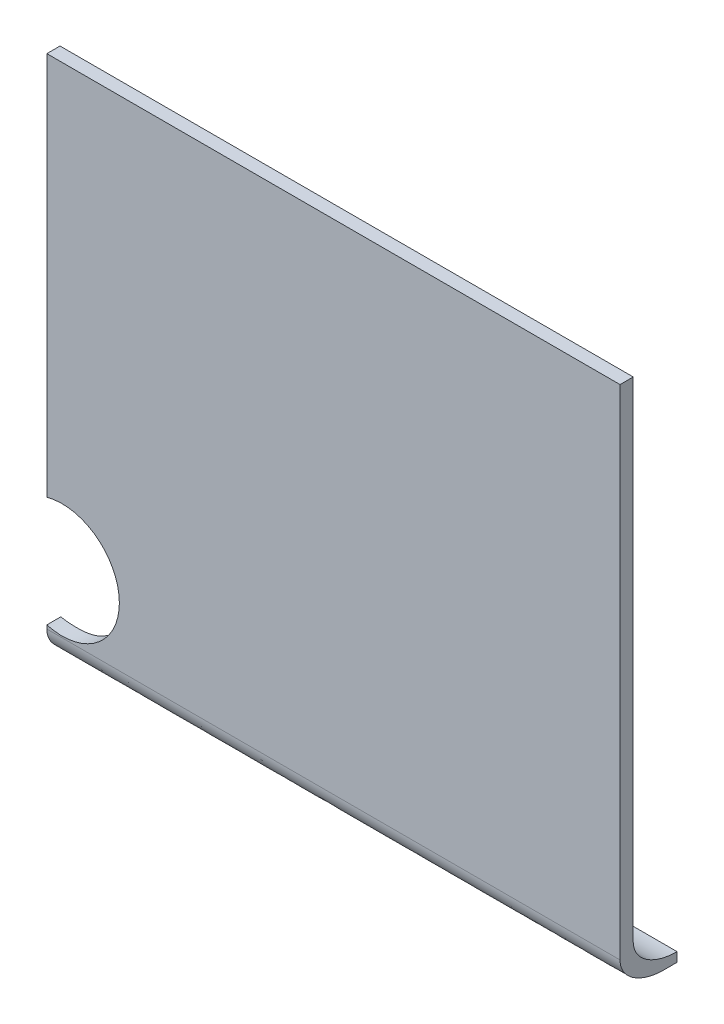
ISO-10303-21;
HEADER;
FILE_DESCRIPTION(('STEP AP214'),'2;1');
FILE_NAME('part.step','',(''),(''),'','','');
FILE_SCHEMA(('AUTOMOTIVE_DESIGN { 1 0 10303 214 1 1 1 1 }'));
ENDSEC;
DATA;
#1=APPLICATION_CONTEXT('core data for automotive mechanical design processes');
#2=APPLICATION_PROTOCOL_DEFINITION('international standard','automotive_design',2000,#1);
#3=PRODUCT_CONTEXT('',#1,'mechanical');
#4=PRODUCT('Part','Part','',(#3));
#5=PRODUCT_RELATED_PRODUCT_CATEGORY('part','',(#4));
#6=PRODUCT_DEFINITION_FORMATION('','',#4);
#7=PRODUCT_DEFINITION_CONTEXT('part definition',#1,'design');
#8=PRODUCT_DEFINITION('design','',#6,#7);
#9=PRODUCT_DEFINITION_SHAPE('','',#8);
#10=(LENGTH_UNIT() NAMED_UNIT(*) SI_UNIT(.MILLI.,.METRE.));
#11=(NAMED_UNIT(*) PLANE_ANGLE_UNIT() SI_UNIT($,.RADIAN.));
#12=(NAMED_UNIT(*) SI_UNIT($,.STERADIAN.) SOLID_ANGLE_UNIT());
#13=UNCERTAINTY_MEASURE_WITH_UNIT(LENGTH_MEASURE(1.E-05),#10,'distance_accuracy_value','');
#14=(GEOMETRIC_REPRESENTATION_CONTEXT(3) GLOBAL_UNCERTAINTY_ASSIGNED_CONTEXT((#13)) GLOBAL_UNIT_ASSIGNED_CONTEXT((#10,
#11,#12)) REPRESENTATION_CONTEXT('',''));
#15=CARTESIAN_POINT('',(0.,0.,0.));
#16=DIRECTION('',(0.,0.,1.));
#17=DIRECTION('',(1.,0.,0.));
#18=AXIS2_PLACEMENT_3D('',#15,#16,#17);
#19=CARTESIAN_POINT('',(-150.,0.,0.));
#20=DIRECTION('',(1.,0.,0.));
#21=DIRECTION('',(0.,0.,-1.));
#22=AXIS2_PLACEMENT_3D('',#19,#20,#21);
#23=PLANE('',#22);
#24=DIRECTION('',(0.,1.,0.));
#25=VECTOR('',#24,1.);
#26=CARTESIAN_POINT('',(-150.,25.118910613293,233.450026632189));
#27=LINE('',#26,#25);
#28=CARTESIAN_POINT('',(-150.,44.5820382074878,233.450026632189));
#29=VERTEX_POINT('',#28);
#30=CARTESIAN_POINT('',(-150.,145.118910613293,233.450026632189));
#31=VERTEX_POINT('',#30);
#32=EDGE_CURVE('E273',#29,#31,#27,.T.);
#33=ORIENTED_EDGE('',*,*,#32,.T.);
#34=DIRECTION('',(0.,0.,1.));
#35=VECTOR('',#34,1.);
#36=CARTESIAN_POINT('',(-150.,145.118910613293,230.000026632189));
#37=LINE('',#36,#35);
#38=CARTESIAN_POINT('',(-150.,145.118910613293,230.000026632189));
#39=VERTEX_POINT('',#38);
#40=EDGE_CURVE('E285',#39,#31,#37,.T.);
#41=ORIENTED_EDGE('',*,*,#40,.F.);
#42=DIRECTION('',(0.,1.,0.));
#43=VECTOR('',#42,1.);
#44=CARTESIAN_POINT('',(-150.,25.118910613293,230.000026632189));
#45=LINE('',#44,#43);
#46=CARTESIAN_POINT('',(-150.,44.5820382074878,230.000026632189));
#47=VERTEX_POINT('',#46);
#48=EDGE_CURVE('E284',#47,#39,#45,.T.);
#49=ORIENTED_EDGE('',*,*,#48,.F.);
#50=DIRECTION('',(0.,0.,1.));
#51=VECTOR('',#50,1.);
#52=CARTESIAN_POINT('',(-150.,44.5820382074878,-310.549973367812));
#53=LINE('',#52,#51);
#54=EDGE_CURVE('E53',#29,#47,#53,.F.);
#55=ORIENTED_EDGE('',*,*,#54,.F.);
#56=EDGE_LOOP('',(#33,#41,#49,#55));
#57=FACE_BOUND('',#56,.T.);
#58=ADVANCED_FACE('F34',(#57),#23,.F.);
#59=CARTESIAN_POINT('',(-150.,14.718910613293,210.450026632189));
#60=CARTESIAN_POINT('',(-150.,30.718910613293,210.450026632189));
#61=CARTESIAN_POINT('',(-150.,30.718910613293,233.450026632189));
#62=CARTESIAN_POINT('',(-150.,14.718910613293,233.450026632189));
#63=CARTESIAN_POINT('',(-150.,-1.28108938670702,233.450026632189));
#64=CARTESIAN_POINT('',(-150.,-1.281089386707,210.450026632189));
#65=CARTESIAN_POINT('',(-150.,14.718910613293,210.450026632189));
#66=(BOUNDED_CURVE() B_SPLINE_CURVE(3,(#59,#60,#61,#62,#63,#64,#65),.UNSPECIFIED.,.T.,
.F.) B_SPLINE_CURVE_WITH_KNOTS((4,3,4),(0.,0.5,1.),
.UNSPECIFIED.) CURVE() GEOMETRIC_REPRESENTATION_ITEM() RATIONAL_B_SPLINE_CURVE((1.,
0.333333333333333,0.333333333333333,1.,0.333333333333333,0.333333333333333,1.)) REPRESENTATION_ITEM(''));
#67=CARTESIAN_POINT('',(-150.,8.39851723940006,229.00002663219));
#68=VERTEX_POINT('',#67);
#69=CARTESIAN_POINT('',(-150.,14.718910613293,233.450026632189));
#70=VERTEX_POINT('',#69);
#71=EDGE_CURVE('E156',#68,#70,#66,.F.);
#72=ORIENTED_EDGE('',*,*,#71,.T.);
#73=CARTESIAN_POINT('',(-150.,15.6557830190986,233.450026632189));
#74=VERTEX_POINT('',#73);
#75=EDGE_CURVE('E269',#70,#74,#27,.T.);
#76=ORIENTED_EDGE('',*,*,#75,.T.);
#77=DIRECTION('',(0.,0.,1.));
#78=VECTOR('',#77,1.);
#79=CARTESIAN_POINT('',(-150.,15.6557830190986,-310.549973367812));
#80=LINE('',#79,#78);
#81=CARTESIAN_POINT('',(-149.999999999988,15.6557830190954,229.8060585008));
#82=VERTEX_POINT('',#81);
#83=EDGE_CURVE('E61',#82,#74,#80,.T.);
#84=ORIENTED_EDGE('',*,*,#83,.F.);
#85=CARTESIAN_POINT('',(-150.,9.11891061329306,218.500026632189));
#86=CARTESIAN_POINT('',(-150.,9.11891061329303,241.500026632189));
#87=CARTESIAN_POINT('',(-150.,25.118910613293,241.500026632189));
#88=CARTESIAN_POINT('',(-150.,25.1189106132931,218.500026632189));
#89=CARTESIAN_POINT('',(-150.,25.118910613293,195.500026632189));
#90=CARTESIAN_POINT('',(-150.,9.11891061329301,195.500026632189));
#91=CARTESIAN_POINT('',(-150.,9.11891061329306,218.500026632189));
#92=(BOUNDED_CURVE() B_SPLINE_CURVE(3,(#85,#86,#87,#88,#89,#90,#91),.UNSPECIFIED.,.T.,
.F.) B_SPLINE_CURVE_WITH_KNOTS((4,3,4),(0.,0.5,1.),
.UNSPECIFIED.) CURVE() GEOMETRIC_REPRESENTATION_ITEM() RATIONAL_B_SPLINE_CURVE((1.,
0.333333333333333,0.333333333333333,1.,0.333333333333333,0.333333333333333,1.)) REPRESENTATION_ITEM(''));
#93=CARTESIAN_POINT('',(-150.,13.8560126934151,229.000026632188));
#94=VERTEX_POINT('',#93);
#95=EDGE_CURVE('E182',#94,#82,#92,.T.);
#96=ORIENTED_EDGE('',*,*,#95,.F.);
#97=DIRECTION('',(0.,1.,0.));
#98=VECTOR('',#97,1.);
#99=CARTESIAN_POINT('',(-150.,-59.381089386707,229.000026632188));
#100=LINE('',#99,#98);
#101=EDGE_CURVE('E276',#68,#94,#100,.T.);
#102=ORIENTED_EDGE('',*,*,#101,.F.);
#103=EDGE_LOOP('',(#72,#76,#84,#96,#102));
#104=FACE_BOUND('',#103,.T.);
#105=ADVANCED_FACE('F252',(#104),#23,.F.);
#106=CARTESIAN_POINT('',(0.,0.,0.));
#107=DIRECTION('',(1.,0.,0.));
#108=DIRECTION('',(0.,0.,-1.));
#109=AXIS2_PLACEMENT_3D('',#106,#107,#108);
#110=PLANE('',#109);
#111=CARTESIAN_POINT('',(0.,14.718910613293,210.450026632189));
#112=CARTESIAN_POINT('',(0.,30.718910613293,210.450026632189));
#113=CARTESIAN_POINT('',(0.,30.718910613293,233.450026632189));
#114=CARTESIAN_POINT('',(0.,14.718910613293,233.450026632189));
#115=CARTESIAN_POINT('',(0.,-1.28108938670696,233.450026632189));
#116=CARTESIAN_POINT('',(0.,-1.28108938670698,210.450026632189));
#117=CARTESIAN_POINT('',(0.,14.718910613293,210.450026632189));
#118=(BOUNDED_CURVE() B_SPLINE_CURVE(3,(#111,#112,#113,#114,#115,#116,#117),.UNSPECIFIED.,.T.,
.F.) B_SPLINE_CURVE_WITH_KNOTS((4,3,4),(0.,0.5,1.),
.UNSPECIFIED.) CURVE() GEOMETRIC_REPRESENTATION_ITEM() RATIONAL_B_SPLINE_CURVE((1.,
0.333333333333333,0.333333333333333,1.,0.333333333333333,0.333333333333333,1.)) REPRESENTATION_ITEM(''));
#119=CARTESIAN_POINT('',(0.,6.71891061329299,221.950026632189));
#120=VERTEX_POINT('',#119);
#121=CARTESIAN_POINT('',(0.,14.718910613293,233.450026632189));
#122=VERTEX_POINT('',#121);
#123=EDGE_CURVE('E38',#120,#122,#118,.F.);
#124=ORIENTED_EDGE('',*,*,#123,.F.);
#125=DIRECTION('',(0.,0.,1.));
#126=VECTOR('',#125,1.);
#127=CARTESIAN_POINT('',(0.,6.71891061329299,-202.589640738144));
#128=LINE('',#127,#126);
#129=CARTESIAN_POINT('',(0.,6.71891061329299,218.500026632189));
#130=VERTEX_POINT('',#129);
#131=EDGE_CURVE('E274',#130,#120,#128,.T.);
#132=ORIENTED_EDGE('',*,*,#131,.F.);
#133=DIRECTION('',(0.,1.,0.));
#134=VECTOR('',#133,1.);
#135=CARTESIAN_POINT('',(0.,-59.381089386707,218.500026632189));
#136=LINE('',#135,#134);
#137=CARTESIAN_POINT('',(0.,9.11891061329306,218.500026632189));
#138=VERTEX_POINT('',#137);
#139=EDGE_CURVE('E11',#130,#138,#136,.T.);
#140=ORIENTED_EDGE('',*,*,#139,.T.);
#141=CARTESIAN_POINT('',(0.,9.11891061329306,218.500026632189));
#142=CARTESIAN_POINT('',(0.,9.1189106132931,241.500026632189));
#143=CARTESIAN_POINT('',(0.,25.1189106132931,241.500026632189));
#144=CARTESIAN_POINT('',(0.,25.1189106132931,218.500026632189));
#145=CARTESIAN_POINT('',(0.,25.1189106132931,195.500026632189));
#146=CARTESIAN_POINT('',(0.,9.1189106132931,195.500026632189));
#147=CARTESIAN_POINT('',(0.,9.11891061329306,218.500026632189));
#148=(BOUNDED_CURVE() B_SPLINE_CURVE(3,(#141,#142,#143,#144,#145,#146,#147),.UNSPECIFIED.,.T.,
.F.) B_SPLINE_CURVE_WITH_KNOTS((4,3,4),(0.,0.5,1.),
.UNSPECIFIED.) CURVE() GEOMETRIC_REPRESENTATION_ITEM() RATIONAL_B_SPLINE_CURVE((1.,
0.333333333333333,0.333333333333333,1.,0.333333333333333,0.333333333333333,1.)) REPRESENTATION_ITEM(''));
#149=CARTESIAN_POINT('',(0.,17.1189106132931,230.000026632189));
#150=VERTEX_POINT('',#149);
#151=EDGE_CURVE('E45',#138,#150,#148,.T.);
#152=ORIENTED_EDGE('',*,*,#151,.T.);
#153=DIRECTION('',(0.,1.,0.));
#154=VECTOR('',#153,1.);
#155=CARTESIAN_POINT('',(0.,25.118910613293,230.000026632189));
#156=LINE('',#155,#154);
#157=CARTESIAN_POINT('',(0.,145.118910613293,230.000026632189));
#158=VERTEX_POINT('',#157);
#159=EDGE_CURVE('E277',#150,#158,#156,.T.);
#160=ORIENTED_EDGE('',*,*,#159,.T.);
#161=DIRECTION('',(0.,0.,1.));
#162=VECTOR('',#161,1.);
#163=CARTESIAN_POINT('',(0.,145.118910613293,230.000026632189));
#164=LINE('',#163,#162);
#165=CARTESIAN_POINT('',(0.,145.118910613293,233.450026632189));
#166=VERTEX_POINT('',#165);
#167=EDGE_CURVE('E305',#158,#166,#164,.T.);
#168=ORIENTED_EDGE('',*,*,#167,.T.);
#169=DIRECTION('',(0.,1.,0.));
#170=VECTOR('',#169,1.);
#171=CARTESIAN_POINT('',(0.,25.118910613293,233.450026632189));
#172=LINE('',#171,#170);
#173=EDGE_CURVE('E295',#122,#166,#172,.T.);
#174=ORIENTED_EDGE('',*,*,#173,.F.);
#175=EDGE_LOOP('',(#124,#132,#140,#152,#160,#168,#174));
#176=FACE_BOUND('',#175,.T.);
#177=ADVANCED_FACE('F36',(#176),#110,.T.);
#178=CARTESIAN_POINT('',(-199.506364446809,145.118910613293,230.000026632189));
#179=DIRECTION('',(0.,-1.,0.));
#180=DIRECTION('',(1.,0.,0.));
#181=AXIS2_PLACEMENT_3D('',#178,#179,#180);
#182=PLANE('',#181);
#183=DIRECTION('',(1.,0.,0.));
#184=VECTOR('',#183,1.);
#185=CARTESIAN_POINT('',(-262.506364446809,145.118910613293,230.000026632189));
#186=LINE('',#185,#184);
#187=EDGE_CURVE('E160',#39,#158,#186,.T.);
#188=ORIENTED_EDGE('',*,*,#187,.F.);
#189=ORIENTED_EDGE('',*,*,#40,.T.);
#190=DIRECTION('',(1.,0.,0.));
#191=VECTOR('',#190,1.);
#192=CARTESIAN_POINT('',(-262.506364446809,145.118910613293,233.450026632189));
#193=LINE('',#192,#191);
#194=EDGE_CURVE('E157',#31,#166,#193,.T.);
#195=ORIENTED_EDGE('',*,*,#194,.T.);
#196=ORIENTED_EDGE('',*,*,#167,.F.);
#197=EDGE_LOOP('',(#188,#189,#195,#196));
#198=FACE_BOUND('',#197,.T.);
#199=ADVANCED_FACE('F261',(#198),#182,.F.);
#200=CARTESIAN_POINT('',(-133.022822584558,-59.381089386707,229.000026632188));
#201=DIRECTION('',(1.,0.,0.));
#202=DIRECTION('',(0.,0.,-1.));
#203=AXIS2_PLACEMENT_3D('',#200,#201,#202);
#204=PLANE('',#203);
#205=CARTESIAN_POINT('',(-133.022822584558,14.718910613293,210.450026632189));
#206=CARTESIAN_POINT('',(-133.022822584558,30.718910613293,210.450026632189));
#207=CARTESIAN_POINT('',(-133.022822584558,30.718910613293,233.450026632189));
#208=CARTESIAN_POINT('',(-133.022822584558,14.718910613293,233.450026632189));
#209=CARTESIAN_POINT('',(-133.022822584558,-1.28108938670702,233.450026632189));
#210=CARTESIAN_POINT('',(-133.022822584558,-1.281089386707,210.450026632189));
#211=CARTESIAN_POINT('',(-133.022822584558,14.718910613293,210.450026632189));
#212=(BOUNDED_CURVE() B_SPLINE_CURVE(3,(#205,#206,#207,#208,#209,#210,#211),.UNSPECIFIED.,.T.,
.F.) B_SPLINE_CURVE_WITH_KNOTS((4,3,4),(0.,0.5,1.),
.UNSPECIFIED.) CURVE() GEOMETRIC_REPRESENTATION_ITEM() RATIONAL_B_SPLINE_CURVE((1.,
0.333333333333333,0.333333333333333,1.,0.333333333333333,0.333333333333333,1.)) REPRESENTATION_ITEM(''));
#213=CARTESIAN_POINT('',(-133.022822584558,6.7919090681207,223.500026632189));
#214=VERTEX_POINT('',#213);
#215=CARTESIAN_POINT('',(-133.022822584558,8.39851723939925,229.000026632188));
#216=VERTEX_POINT('',#215);
#217=EDGE_CURVE('E130',#214,#216,#212,.F.);
#218=ORIENTED_EDGE('',*,*,#217,.T.);
#219=DIRECTION('',(0.,1.,0.));
#220=VECTOR('',#219,1.);
#221=CARTESIAN_POINT('',(-133.022822584558,-59.381089386707,229.000026632188));
#222=LINE('',#221,#220);
#223=CARTESIAN_POINT('',(-133.022822584558,13.8560126934151,229.000026632188));
#224=VERTEX_POINT('',#223);
#225=EDGE_CURVE('E133',#216,#224,#222,.T.);
#226=ORIENTED_EDGE('',*,*,#225,.T.);
#227=CARTESIAN_POINT('',(-133.022822584558,9.11891061329309,218.500026632189));
#228=CARTESIAN_POINT('',(-133.022822584558,9.11891061329303,241.500026632189));
#229=CARTESIAN_POINT('',(-133.022822584558,25.1189106132931,241.500026632189));
#230=CARTESIAN_POINT('',(-133.022822584558,25.1189106132931,218.500026632189));
#231=CARTESIAN_POINT('',(-133.022822584558,25.118910613293,195.500026632189));
#232=CARTESIAN_POINT('',(-133.022822584558,9.11891061329302,195.500026632189));
#233=CARTESIAN_POINT('',(-133.022822584558,9.11891061329309,218.500026632189));
#234=(BOUNDED_CURVE() B_SPLINE_CURVE(3,(#227,#228,#229,#230,#231,#232,#233),.UNSPECIFIED.,.T.,
.F.) B_SPLINE_CURVE_WITH_KNOTS((4,3,4),(0.,0.5,1.),
.UNSPECIFIED.) CURVE() GEOMETRIC_REPRESENTATION_ITEM() RATIONAL_B_SPLINE_CURVE((1.,
0.333333333333333,0.333333333333333,1.,0.333333333333333,0.333333333333333,1.)) REPRESENTATION_ITEM(''));
#235=CARTESIAN_POINT('',(-133.022822584558,9.91462707339463,223.500026632189));
#236=VERTEX_POINT('',#235);
#237=EDGE_CURVE('E194',#236,#224,#234,.T.);
#238=ORIENTED_EDGE('',*,*,#237,.F.);
#239=DIRECTION('',(0.,1.,0.));
#240=VECTOR('',#239,1.);
#241=CARTESIAN_POINT('',(-133.022822584558,-59.381089386707,223.500026632189));
#242=LINE('',#241,#240);
#243=EDGE_CURVE('E136',#214,#236,#242,.T.);
#244=ORIENTED_EDGE('',*,*,#243,.F.);
#245=EDGE_LOOP('',(#218,#226,#238,#244));
#246=FACE_BOUND('',#245,.T.);
#247=ADVANCED_FACE('F132',(#246),#204,.F.);
#248=CARTESIAN_POINT('',(-304.054799780113,9.11891061329301,218.500026632189));
#249=CARTESIAN_POINT('',(-304.054799780113,9.118910613293,241.500026632189));
#250=CARTESIAN_POINT('',(-304.054799780113,25.118910613293,241.500026632189));
#251=CARTESIAN_POINT('',(-304.054799780113,25.118910613293,218.500026632189));
#252=CARTESIAN_POINT('',(-304.054799780113,25.118910613293,195.500026632189));
#253=CARTESIAN_POINT('',(-304.054799780113,9.118910613293,195.500026632189));
#254=CARTESIAN_POINT('',(-304.054799780113,9.11891061329301,218.500026632189));
#255=(BOUNDED_CURVE() B_SPLINE_CURVE(3,(#248,#249,#250,#251,#252,#253,#254),.UNSPECIFIED.,.T.,
.F.) B_SPLINE_CURVE_WITH_KNOTS((4,3,4),(0.,0.5,1.),
.UNSPECIFIED.) CURVE() GEOMETRIC_REPRESENTATION_ITEM() RATIONAL_B_SPLINE_CURVE((1.,
0.333333333333333,0.333333333333333,1.,0.333333333333333,0.333333333333333,1.)) REPRESENTATION_ITEM(''));
#256=DIRECTION('',(-1.,0.,0.));
#257=VECTOR('',#256,1.);
#258=SURFACE_OF_LINEAR_EXTRUSION('',#255,#257);
#259=DIRECTION('',(-1.,0.,0.));
#260=VECTOR('',#259,1.);
#261=CARTESIAN_POINT('',(-1.50636444680924,13.8560126934151,229.000026632188));
#262=LINE('',#261,#260);
#263=EDGE_CURVE('E148',#224,#94,#262,.T.);
#264=ORIENTED_EDGE('',*,*,#263,.T.);
#265=ORIENTED_EDGE('',*,*,#95,.T.);
#266=CARTESIAN_POINT('',(-153.506137358087,17.118910613293,230.000026632189));
#267=CARTESIAN_POINT('',(-153.335295126302,17.0205629130991,230.000016479904));
#268=CARTESIAN_POINT('',(-153.162532348825,16.9256015163135,229.997419527962));
#269=CARTESIAN_POINT('',(-152.813624526343,16.7426724111914,229.988057172344));
#270=CARTESIAN_POINT('',(-152.637482274155,16.6546992127639,229.981295078207));
#271=CARTESIAN_POINT('',(-152.282053399776,16.4858353735329,229.964606795916));
#272=CARTESIAN_POINT('',(-152.10276769867,16.4049426983076,229.954681520458));
#273=CARTESIAN_POINT('',(-151.741279812592,16.2503169689871,229.932588335206));
#274=CARTESIAN_POINT('',(-151.559077708407,16.176583716966,229.920420487435));
#275=CARTESIAN_POINT('',(-151.19171881639,16.0362533963667,229.894684296707));
#276=CARTESIAN_POINT('',(-151.006557868061,15.9696676229948,229.881113801673));
#277=CARTESIAN_POINT('',(-150.633781911419,15.8438359278121,229.853386389901));
#278=CARTESIAN_POINT('',(-150.446166654951,15.7845907546477,229.839229413544));
#279=CARTESIAN_POINT('',(-150.068723715093,15.6735173787558,229.811061865102));
#280=CARTESIAN_POINT('',(-149.878895847536,15.6216897982658,229.797051305391));
#281=CARTESIAN_POINT('',(-149.497283724619,15.5255270109825,229.769836630317));
#282=CARTESIAN_POINT('',(-149.305499326359,15.4811923556711,229.756632574359));
#283=CARTESIAN_POINT('',(-148.845391665354,15.384332146564,229.726760933655));
#284=CARTESIAN_POINT('',(-148.576278275811,15.33531551285,229.710740570638));
#285=CARTESIAN_POINT('',(-148.035579501988,15.2520469919587,229.682690790606));
#286=CARTESIAN_POINT('',(-147.76399416966,15.2177947952144,229.670661289915));
#287=CARTESIAN_POINT('',(-147.219188208678,15.1641915720874,229.651528580223));
#288=CARTESIAN_POINT('',(-146.945967647912,15.1448399313697,229.644425168124));
#289=CARTESIAN_POINT('',(-146.399054008907,15.1211341581231,229.635692373942));
#290=CARTESIAN_POINT('',(-146.125361644866,15.1167655144046,229.634057695371));
#291=CARTESIAN_POINT('',(-145.5781569808,15.1230066184847,229.636373721515));
#292=CARTESIAN_POINT('',(-145.304644688462,15.1336169688923,229.640324650941));
#293=CARTESIAN_POINT('',(-144.758779558958,15.1697625522849,229.653503066801));
#294=CARTESIAN_POINT('',(-144.486426616345,15.1952963973942,229.662730062564));
#295=CARTESIAN_POINT('',(-143.816934957958,15.2765783014517,229.691162448171));
#296=CARTESIAN_POINT('',(-143.420916748667,15.3408676631038,229.713015423734));
#297=CARTESIAN_POINT('',(-142.63564498839,15.5008504258686,229.7629598315));
#298=CARTESIAN_POINT('',(-142.246392904187,15.596550549068,229.791052598637));
#299=CARTESIAN_POINT('',(-141.477276392258,15.8186282290896,229.848265230908));
#300=CARTESIAN_POINT('',(-141.097402536492,15.9449734685497,229.877383986596));
#301=CARTESIAN_POINT('',(-140.348806819976,16.2277099423998,229.930282099936));
#302=CARTESIAN_POINT('',(-139.980077935587,16.3840817767488,229.954064883736));
#303=CARTESIAN_POINT('',(-139.434536613891,16.6416826140468,229.980223567225));
#304=CARTESIAN_POINT('',(-139.252775552158,16.7320639023053,229.987372118157));
#305=CARTESIAN_POINT('',(-138.893177485563,16.920073983709,229.997266658159));
#306=CARTESIAN_POINT('',(-138.715336395612,17.0176947194122,230.000017467155));
#307=CARTESIAN_POINT('',(-138.539507810992,17.1189106132931,230.000026632189));
#308=B_SPLINE_CURVE_WITH_KNOTS('',3,(#266,#267,#268,#269,#270,#271,#272,#273,#274,#275,#276,
#277,#278,#279,#280,#281,#282,#283,#284,#285,#286,#287,#288,#289,#290,#291,#292,#293,#294,#295,
#296,#297,#298,#299,#300,#301,#302,#303,#304,#305,#306,#307),.UNSPECIFIED.,.F.,.F.,(4,2,2,2,2,2,
2,2,2,2,2,2,2,2,2,2,2,2,2,2,4),(0.,0.591292359741734,1.18211549521779,1.77276831046459,
2.36340479215302,2.95496132952328,3.54657814845931,4.13824456714247,4.72995451372925,
5.55153374303784,6.37309574540273,7.19462387377325,8.01535611851211,8.83612138247367,
9.65681032791514,10.8607501284606,12.0649477473405,13.2678809373673,14.4700395172494,
15.079204962882,15.6877023042666),.UNSPECIFIED.);
#309=CARTESIAN_POINT('',(-138.539507810992,17.1189106132931,230.000026632189));
#310=VERTEX_POINT('',#309);
#311=EDGE_CURVE('E229',#82,#310,#308,.T.);
#312=ORIENTED_EDGE('',*,*,#311,.T.);
#313=DIRECTION('',(1.,0.,0.));
#314=VECTOR('',#313,1.);
#315=CARTESIAN_POINT('',(-208.506364446809,17.118910613293,230.000026632189));
#316=LINE('',#315,#314);
#317=EDGE_CURVE('E178',#150,#310,#316,.F.);
#318=ORIENTED_EDGE('',*,*,#317,.F.);
#319=ORIENTED_EDGE('',*,*,#151,.F.);
#320=DIRECTION('',(1.,0.,0.));
#321=VECTOR('',#320,1.);
#322=CARTESIAN_POINT('',(205.493635553191,9.11891061329315,218.500026632189));
#323=LINE('',#322,#321);
#324=CARTESIAN_POINT('',(-128.022822584558,9.11891061329306,218.500026632189));
#325=VERTEX_POINT('',#324);
#326=EDGE_CURVE('E179',#325,#138,#323,.T.);
#327=ORIENTED_EDGE('',*,*,#326,.F.);
#328=CARTESIAN_POINT('',(-133.022822584558,9.91462707339463,223.500026632189));
#329=CARTESIAN_POINT('',(-133.022840835873,9.87027749899119,223.368029655093));
#330=CARTESIAN_POINT('',(-133.017595868185,9.82789737165104,223.235353445482));
#331=CARTESIAN_POINT('',(-132.996390223536,9.74717069250815,222.969602821246));
#332=CARTESIAN_POINT('',(-132.98042730374,9.70882498689061,222.83652832908));
#333=CARTESIAN_POINT('',(-132.937601977038,9.63629006958088,222.571032565645));
#334=CARTESIAN_POINT('',(-132.910742451,9.60209976237882,222.438611131079));
#335=CARTESIAN_POINT('',(-132.846084676911,9.53787604322264,222.175452828111));
#336=CARTESIAN_POINT('',(-132.80828749099,9.50784222806018,222.044715797429));
#337=CARTESIAN_POINT('',(-132.721748789894,9.45181084166099,221.785743596374));
#338=CARTESIAN_POINT('',(-132.672987033915,9.42582088754574,221.657513535941));
#339=CARTESIAN_POINT('',(-132.564765978702,9.37780000975851,221.404881364192));
#340=CARTESIAN_POINT('',(-132.505306616702,9.35576910931723,221.280479275341));
#341=CARTESIAN_POINT('',(-132.376058836384,9.31546082712875,221.036621173838));
#342=CARTESIAN_POINT('',(-132.30627637594,9.29718129474787,220.91716235878));
#343=CARTESIAN_POINT('',(-132.156802907943,9.26407913805948,220.684112995405));
#344=CARTESIAN_POINT('',(-132.077112145904,9.24925642812234,220.570522301781));
#345=CARTESIAN_POINT('',(-131.910098883754,9.22300653529211,220.352398437532));
#346=CARTESIAN_POINT('',(-131.822966395179,9.2115159552145,220.24772729557));
#347=CARTESIAN_POINT('',(-131.640279020765,9.19117938260795,220.045672065378));
#348=CARTESIAN_POINT('',(-131.544721279458,9.18233429117809,219.94829046854));
#349=CARTESIAN_POINT('',(-131.345869590312,9.16692418094119,219.761583212651));
#350=CARTESIAN_POINT('',(-131.242575731714,9.16035913583742,219.672257460697));
#351=CARTESIAN_POINT('',(-131.028925865848,9.14912925180306,219.502279096432));
#352=CARTESIAN_POINT('',(-130.918567272809,9.14446511327958,219.421629689045));
#353=CARTESIAN_POINT('',(-130.690336450424,9.13662532928925,219.26878119556));
#354=CARTESIAN_POINT('',(-130.572395156605,9.13346654906274,219.196684355505));
#355=CARTESIAN_POINT('',(-130.330884996805,9.12834734582527,219.062466074235));
#356=CARTESIAN_POINT('',(-130.207313938187,9.12638739408634,219.000348563065));
#357=CARTESIAN_POINT('',(-129.955517463697,9.12333350930149,218.886594499935));
#358=CARTESIAN_POINT('',(-129.827295136141,9.1222390122391,218.834951138321));
#359=CARTESIAN_POINT('',(-129.567009404984,9.12062382520678,218.742444304486));
#360=CARTESIAN_POINT('',(-129.434945017502,9.12010328356761,218.701583620971));
#361=CARTESIAN_POINT('',(-129.092984809388,9.11918973347886,218.611148581778));
#362=CARTESIAN_POINT('',(-128.880908891737,9.11903128522049,218.56950325273));
#363=CARTESIAN_POINT('',(-128.560377262727,9.11892916376731,218.527836566824));
#364=CARTESIAN_POINT('',(-128.45315415817,9.11891770279363,218.517414562795));
#365=CARTESIAN_POINT('',(-128.238241194014,9.11891011163262,218.503510147622));
#366=CARTESIAN_POINT('',(-128.13055126082,9.1189139839574,218.500028873744));
#367=CARTESIAN_POINT('',(-128.022822584558,9.11891061329308,218.500026632189));
#368=B_SPLINE_CURVE_WITH_KNOTS('',3,(#328,#329,#330,#331,#332,#333,#334,#335,#336,#337,#338,
#339,#340,#341,#342,#343,#344,#345,#346,#347,#348,#349,#350,#351,#352,#353,#354,#355,#356,#357,
#358,#359,#360,#361,#362,#363,#364,#365,#366,#367),.UNSPECIFIED.,.F.,.F.,(4,2,2,2,2,2,2,2,2,2,2,
2,2,2,2,2,2,2,2,4),(0.,0.417655192038544,0.835397809753616,1.25303005575222,1.67062176010701,
2.08899076921489,2.5073622331246,2.92549317334851,3.34361375486923,3.75316014609657,
4.16284587743949,4.57252688354728,4.98235870434498,5.39667998699757,5.81116403918627,
6.22537774915216,6.63969848178859,7.28598036041428,7.60897995116199,7.93203246239597),.UNSPECIFIED.);
#369=EDGE_CURVE('E200',#325,#236,#368,.F.);
#370=ORIENTED_EDGE('',*,*,#369,.T.);
#371=ORIENTED_EDGE('',*,*,#237,.T.);
#372=EDGE_LOOP('',(#264,#265,#312,#318,#319,#327,#370,#371));
#373=FACE_BOUND('',#372,.T.);
#374=ADVANCED_FACE('F217',(#373),#258,.F.);
#375=CARTESIAN_POINT('',(-262.506364446809,25.118910613293,230.000026632189));
#376=DIRECTION('',(0.,0.,1.));
#377=DIRECTION('',(0.,-1.,0.));
#378=AXIS2_PLACEMENT_3D('',#375,#376,#377);
#379=PLANE('',#378);
#380=CARTESIAN_POINT('',(-146.02282258454,30.1189106132932,230.000026632189));
#381=DIRECTION('',(0.,0.,1.));
#382=DIRECTION('',(0.,-1.,0.));
#383=AXIS2_PLACEMENT_3D('',#380,#381,#382);
#384=CIRCLE('',#383,15.);
#385=EDGE_CURVE('E150',#310,#47,#384,.T.);
#386=ORIENTED_EDGE('',*,*,#385,.T.);
#387=ORIENTED_EDGE('',*,*,#48,.T.);
#388=ORIENTED_EDGE('',*,*,#187,.T.);
#389=ORIENTED_EDGE('',*,*,#159,.F.);
#390=ORIENTED_EDGE('',*,*,#317,.T.);
#391=EDGE_LOOP('',(#386,#387,#388,#389,#390));
#392=FACE_BOUND('',#391,.T.);
#393=ADVANCED_FACE('F222',(#392),#379,.F.);
#394=CARTESIAN_POINT('',(-262.506364446809,25.118910613293,233.450026632189));
#395=DIRECTION('',(0.,0.,1.));
#396=DIRECTION('',(0.,-1.,0.));
#397=AXIS2_PLACEMENT_3D('',#394,#395,#396);
#398=PLANE('',#397);
#399=ORIENTED_EDGE('',*,*,#75,.F.);
#400=DIRECTION('',(1.,0.,0.));
#401=VECTOR('',#400,1.);
#402=CARTESIAN_POINT('',(-262.506364446809,14.718910613293,233.450026632189));
#403=LINE('',#402,#401);
#404=EDGE_CURVE('E175',#70,#122,#403,.T.);
#405=ORIENTED_EDGE('',*,*,#404,.T.);
#406=ORIENTED_EDGE('',*,*,#173,.T.);
#407=ORIENTED_EDGE('',*,*,#194,.F.);
#408=ORIENTED_EDGE('',*,*,#32,.F.);
#409=CARTESIAN_POINT('',(-146.02282258454,30.1189106132932,233.450026632189));
#410=DIRECTION('',(0.,0.,1.));
#411=DIRECTION('',(1.,0.,0.));
#412=AXIS2_PLACEMENT_3D('',#409,#410,#411);
#413=CIRCLE('',#412,15.);
#414=EDGE_CURVE('E272',#74,#29,#413,.T.);
#415=ORIENTED_EDGE('',*,*,#414,.F.);
#416=EDGE_LOOP('',(#399,#405,#406,#407,#408,#415));
#417=FACE_BOUND('',#416,.T.);
#418=ADVANCED_FACE('F241',(#417),#398,.T.);
#419=CARTESIAN_POINT('',(-146.02282258454,30.1189106132932,-310.549973367811));
#420=DIRECTION('',(0.,0.,1.));
#421=DIRECTION('',(1.,0.,0.));
#422=AXIS2_PLACEMENT_3D('',#419,#420,#421);
#423=CYLINDRICAL_SURFACE('',#422,15.);
#424=ORIENTED_EDGE('',*,*,#414,.T.);
#425=ORIENTED_EDGE('',*,*,#54,.T.);
#426=ORIENTED_EDGE('',*,*,#385,.F.);
#427=ORIENTED_EDGE('',*,*,#311,.F.);
#428=ORIENTED_EDGE('',*,*,#83,.T.);
#429=EDGE_LOOP('',(#424,#425,#426,#427,#428));
#430=FACE_BOUND('',#429,.T.);
#431=ADVANCED_FACE('F238',(#430),#423,.F.);
#432=CARTESIAN_POINT('',(-128.022822584558,-59.381089386707,223.500026632189));
#433=DIRECTION('',(0.,1.,0.));
#434=DIRECTION('',(-1.,0.,0.));
#435=AXIS2_PLACEMENT_3D('',#432,#433,#434);
#436=CYLINDRICAL_SURFACE('',#435,4.99999999999999);
#437=CARTESIAN_POINT('',(-128.022822584558,6.71891061329302,223.500026632189));
#438=DIRECTION('',(0.,-1.,0.));
#439=DIRECTION('',(0.,0.,-1.));
#440=AXIS2_PLACEMENT_3D('',#437,#438,#439);
#441=CIRCLE('',#440,4.99999999999999);
#442=CARTESIAN_POINT('',(-128.022822584558,6.71891061329302,218.500026632189));
#443=VERTEX_POINT('',#442);
#444=CARTESIAN_POINT('',(-132.776505367412,6.71891061329299,221.950026632189));
#445=VERTEX_POINT('',#444);
#446=EDGE_CURVE('E162',#443,#445,#441,.F.);
#447=ORIENTED_EDGE('',*,*,#446,.T.);
#448=CARTESIAN_POINT('',(-132.776505367412,6.71891061329299,221.950026632189));
#449=CARTESIAN_POINT('',(-132.797012211651,6.7189098763217,222.012915730779));
#450=CARTESIAN_POINT('',(-132.816269260044,6.71926945601987,222.07621251356));
#451=CARTESIAN_POINT('',(-132.852164978079,6.72072820671071,222.203191807891));
#452=CARTESIAN_POINT('',(-132.868816334453,6.72182364738653,222.266870776281));
#453=CARTESIAN_POINT('',(-132.899537070886,6.72476768374965,222.394605015024));
#454=CARTESIAN_POINT('',(-132.913614934155,6.7266137377754,222.458658303475));
#455=CARTESIAN_POINT('',(-132.939214626165,6.73107190087285,222.587134402562));
#456=CARTESIAN_POINT('',(-132.950740738425,6.73368270879878,222.651556404822));
#457=CARTESIAN_POINT('',(-132.97125120311,6.73968430408769,222.780767791467));
#458=CARTESIAN_POINT('',(-132.980235550345,6.74307509304334,222.845557176602));
#459=CARTESIAN_POINT('',(-132.99566516192,6.75065124644683,222.97550293222));
#460=CARTESIAN_POINT('',(-133.00210610238,6.75483794622793,223.040659738276));
#461=CARTESIAN_POINT('',(-133.012439300571,6.7640217314592,223.171340118978));
#462=CARTESIAN_POINT('',(-133.016322897669,6.76902149988566,223.236864189699));
#463=CARTESIAN_POINT('',(-133.021521590442,6.77984699261234,223.368280342207));
#464=CARTESIAN_POINT('',(-133.02282359179,6.78567676772474,223.434172608672));
#465=CARTESIAN_POINT('',(-133.022822584558,6.79190906812065,223.500026632189));
#466=B_SPLINE_CURVE_WITH_KNOTS('',3,(#448,#449,#450,#451,#452,#453,#454,#455,#456,#457,#458,
#459,#460,#461,#462,#463,#464,#465),.UNSPECIFIED.,.F.,.F.,(4,2,2,2,2,2,2,2,4),(0.,
0.198430432932327,0.395862473786677,0.592631482127768,0.789067634856727,0.985504188700004,
1.18227326843893,1.37970534035745,1.5781362880671),.UNSPECIFIED.);
#467=EDGE_CURVE('E140',#445,#214,#466,.T.);
#468=ORIENTED_EDGE('',*,*,#467,.T.);
#469=ORIENTED_EDGE('',*,*,#243,.T.);
#470=ORIENTED_EDGE('',*,*,#369,.F.);
#471=DIRECTION('',(0.,1.,0.));
#472=VECTOR('',#471,1.);
#473=CARTESIAN_POINT('',(-128.022822584558,-59.381089386707,218.500026632189));
#474=LINE('',#473,#472);
#475=EDGE_CURVE('E141',#443,#325,#474,.T.);
#476=ORIENTED_EDGE('',*,*,#475,.F.);
#477=EDGE_LOOP('',(#447,#468,#469,#470,#476));
#478=FACE_BOUND('',#477,.T.);
#479=ADVANCED_FACE('F213',(#478),#436,.T.);
#480=CARTESIAN_POINT('',(-262.506364446809,6.71891061329301,-202.589640738144));
#481=DIRECTION('',(0.,-1.,0.));
#482=DIRECTION('',(0.,0.,-1.));
#483=AXIS2_PLACEMENT_3D('',#480,#481,#482);
#484=PLANE('',#483);
#485=DIRECTION('',(-1.,0.,0.));
#486=VECTOR('',#485,1.);
#487=CARTESIAN_POINT('',(-262.506364446809,6.71891061329301,218.500026632189));
#488=LINE('',#487,#486);
#489=EDGE_CURVE('E158',#130,#443,#488,.T.);
#490=ORIENTED_EDGE('',*,*,#489,.F.);
#491=ORIENTED_EDGE('',*,*,#131,.T.);
#492=DIRECTION('',(1.,0.,0.));
#493=VECTOR('',#492,1.);
#494=CARTESIAN_POINT('',(-262.506364446809,6.71891061329301,221.950026632189));
#495=LINE('',#494,#493);
#496=EDGE_CURVE('E167',#120,#445,#495,.F.);
#497=ORIENTED_EDGE('',*,*,#496,.T.);
#498=ORIENTED_EDGE('',*,*,#446,.F.);
#499=EDGE_LOOP('',(#490,#491,#497,#498));
#500=FACE_BOUND('',#499,.T.);
#501=ADVANCED_FACE('F226',(#500),#484,.T.);
#502=CARTESIAN_POINT('',(128.022822584558,-59.3810893867069,218.500026632189));
#503=DIRECTION('',(0.,0.,1.));
#504=DIRECTION('',(1.,0.,0.));
#505=AXIS2_PLACEMENT_3D('',#502,#503,#504);
#506=PLANE('',#505);
#507=ORIENTED_EDGE('',*,*,#139,.F.);
#508=ORIENTED_EDGE('',*,*,#489,.T.);
#509=ORIENTED_EDGE('',*,*,#475,.T.);
#510=ORIENTED_EDGE('',*,*,#326,.T.);
#511=EDGE_LOOP('',(#507,#508,#509,#510));
#512=FACE_BOUND('',#511,.T.);
#513=ADVANCED_FACE('F242',(#512),#506,.F.);
#514=CARTESIAN_POINT('',(-262.506364446809,14.718910613293,210.450026632189));
#515=CARTESIAN_POINT('',(-262.506364446809,30.718910613293,210.450026632189));
#516=CARTESIAN_POINT('',(-262.506364446809,30.718910613293,233.450026632189));
#517=CARTESIAN_POINT('',(-262.506364446809,14.718910613293,233.450026632189));
#518=CARTESIAN_POINT('',(-262.506364446809,-1.28108938670698,233.450026632189));
#519=CARTESIAN_POINT('',(-262.506364446809,-1.28108938670698,210.450026632189));
#520=CARTESIAN_POINT('',(-262.506364446809,14.718910613293,210.450026632189));
#521=(BOUNDED_CURVE() B_SPLINE_CURVE(3,(#514,#515,#516,#517,#518,#519,#520),.UNSPECIFIED.,.T.,
.F.) B_SPLINE_CURVE_WITH_KNOTS((4,3,4),(0.,0.5,1.),
.UNSPECIFIED.) CURVE() GEOMETRIC_REPRESENTATION_ITEM() RATIONAL_B_SPLINE_CURVE((1.,
0.333333333333333,0.333333333333333,1.,0.333333333333333,0.333333333333333,1.)) REPRESENTATION_ITEM(''));
#522=DIRECTION('',(1.,0.,0.));
#523=VECTOR('',#522,1.);
#524=SURFACE_OF_LINEAR_EXTRUSION('',#521,#523);
#525=ORIENTED_EDGE('',*,*,#71,.F.);
#526=DIRECTION('',(1.,0.,0.));
#527=VECTOR('',#526,1.);
#528=CARTESIAN_POINT('',(-1.50636444680916,8.39851723940011,229.00002663219));
#529=LINE('',#528,#527);
#530=EDGE_CURVE('E146',#216,#68,#529,.F.);
#531=ORIENTED_EDGE('',*,*,#530,.F.);
#532=ORIENTED_EDGE('',*,*,#217,.F.);
#533=ORIENTED_EDGE('',*,*,#467,.F.);
#534=ORIENTED_EDGE('',*,*,#496,.F.);
#535=ORIENTED_EDGE('',*,*,#123,.T.);
#536=ORIENTED_EDGE('',*,*,#404,.F.);
#537=EDGE_LOOP('',(#525,#531,#532,#533,#534,#535,#536));
#538=FACE_BOUND('',#537,.T.);
#539=ADVANCED_FACE('F153',(#538),#524,.T.);
#540=CARTESIAN_POINT('',(-159.022822584558,-59.381089386707,229.000026632188));
#541=DIRECTION('',(0.,0.,1.));
#542=DIRECTION('',(1.,0.,0.));
#543=AXIS2_PLACEMENT_3D('',#540,#541,#542);
#544=PLANE('',#543);
#545=ORIENTED_EDGE('',*,*,#530,.T.);
#546=ORIENTED_EDGE('',*,*,#101,.T.);
#547=ORIENTED_EDGE('',*,*,#263,.F.);
#548=ORIENTED_EDGE('',*,*,#225,.F.);
#549=EDGE_LOOP('',(#545,#546,#547,#548));
#550=FACE_BOUND('',#549,.T.);
#551=ADVANCED_FACE('F145',(#550),#544,.F.);
#552=CLOSED_SHELL('',(#58,#105,#177,#199,#247,#374,#393,#418,#431,#479,#501,#513,#539,#551));
#553=MANIFOLD_SOLID_BREP('B2',#552);
#554=ADVANCED_BREP_SHAPE_REPRESENTATION('',(#18,#553),#14);
#555=SHAPE_DEFINITION_REPRESENTATION(#9,#554);
ENDSEC;
END-ISO-10303-21;
